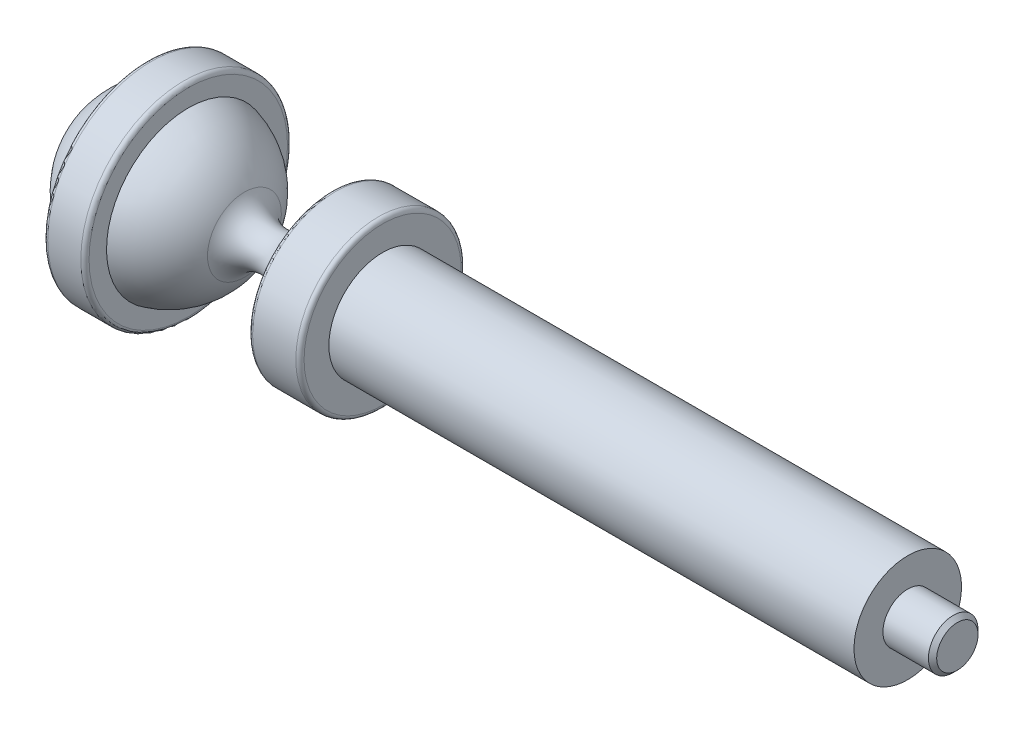
ISO-10303-21;
HEADER;
FILE_DESCRIPTION(('STEP AP214'),'2;1');
FILE_NAME('part.step','',(''),(''),'','','');
FILE_SCHEMA(('AUTOMOTIVE_DESIGN { 1 0 10303 214 1 1 1 1 }'));
ENDSEC;
DATA;
#1=APPLICATION_CONTEXT('core data for automotive mechanical design processes');
#2=APPLICATION_PROTOCOL_DEFINITION('international standard','automotive_design',2000,#1);
#3=PRODUCT_CONTEXT('',#1,'mechanical');
#4=PRODUCT('Part','Part','',(#3));
#5=PRODUCT_RELATED_PRODUCT_CATEGORY('part','',(#4));
#6=PRODUCT_DEFINITION_FORMATION('','',#4);
#7=PRODUCT_DEFINITION_CONTEXT('part definition',#1,'design');
#8=PRODUCT_DEFINITION('design','',#6,#7);
#9=PRODUCT_DEFINITION_SHAPE('','',#8);
#10=(LENGTH_UNIT() NAMED_UNIT(*) SI_UNIT(.MILLI.,.METRE.));
#11=(NAMED_UNIT(*) PLANE_ANGLE_UNIT() SI_UNIT($,.RADIAN.));
#12=(NAMED_UNIT(*) SI_UNIT($,.STERADIAN.) SOLID_ANGLE_UNIT());
#13=UNCERTAINTY_MEASURE_WITH_UNIT(LENGTH_MEASURE(1.E-05),#10,'distance_accuracy_value','');
#14=(GEOMETRIC_REPRESENTATION_CONTEXT(3) GLOBAL_UNCERTAINTY_ASSIGNED_CONTEXT((#13)) GLOBAL_UNIT_ASSIGNED_CONTEXT((#10,
#11,#12)) REPRESENTATION_CONTEXT('',''));
#15=CARTESIAN_POINT('',(0.,0.,0.));
#16=DIRECTION('',(0.,0.,1.));
#17=DIRECTION('',(1.,0.,0.));
#18=AXIS2_PLACEMENT_3D('',#15,#16,#17);
#19=CARTESIAN_POINT('',(10.16,0.,0.));
#20=DIRECTION('',(-1.,0.,0.));
#21=DIRECTION('',(0.,1.,0.));
#22=AXIS2_PLACEMENT_3D('',#19,#20,#21);
#23=SPHERICAL_SURFACE('',#22,10.16);
#24=CARTESIAN_POINT('',(7.5,0.,0.));
#25=DIRECTION('',(-1.,0.,0.));
#26=DIRECTION('',(0.,0.,1.));
#27=AXIS2_PLACEMENT_3D('',#24,#25,#26);
#28=CIRCLE('',#27,9.80561063881286);
#29=CARTESIAN_POINT('',(7.5,0.,9.80561063881286));
#30=VERTEX_POINT('',#29);
#31=EDGE_CURVE('E91',#30,#30,#28,.T.);
#32=ORIENTED_EDGE('',*,*,#31,.T.);
#33=EDGE_LOOP('',(#32));
#34=FACE_BOUND('',#33,.T.);
#35=ADVANCED_FACE('F35',(#34),#23,.T.);
#36=CARTESIAN_POINT('',(105.5,2.50000000000001,0.));
#37=DIRECTION('',(-1.,0.,0.));
#38=DIRECTION('',(0.,0.,1.));
#39=AXIS2_PLACEMENT_3D('',#36,#37,#38);
#40=PLANE('',#39);
#41=CARTESIAN_POINT('',(105.5,0.,0.));
#42=DIRECTION('',(-1.,0.,0.));
#43=DIRECTION('',(0.,0.,1.));
#44=AXIS2_PLACEMENT_3D('',#41,#42,#43);
#45=CIRCLE('',#44,2.50000000000001);
#46=CARTESIAN_POINT('',(105.5,0.,2.50000000000001));
#47=VERTEX_POINT('',#46);
#48=EDGE_CURVE('E67',#47,#47,#45,.T.);
#49=ORIENTED_EDGE('',*,*,#48,.F.);
#50=EDGE_LOOP('',(#49));
#51=FACE_BOUND('',#50,.T.);
#52=ADVANCED_FACE('F112',(#51),#40,.F.);
#53=CARTESIAN_POINT('',(105.5,0.,0.));
#54=DIRECTION('',(-1.,0.,0.));
#55=DIRECTION('',(0.,0.,1.));
#56=AXIS2_PLACEMENT_3D('',#53,#54,#55);
#57=CONICAL_SURFACE('',#56,2.50000000000001,0.785398163397448);
#58=CARTESIAN_POINT('',(105.,0.,0.));
#59=DIRECTION('',(-1.,0.,0.));
#60=DIRECTION('',(0.,0.,1.));
#61=AXIS2_PLACEMENT_3D('',#58,#59,#60);
#62=CIRCLE('',#61,3.00000000000001);
#63=CARTESIAN_POINT('',(105.,0.,3.00000000000001));
#64=VERTEX_POINT('',#63);
#65=EDGE_CURVE('E70',#64,#64,#62,.T.);
#66=ORIENTED_EDGE('',*,*,#65,.F.);
#67=EDGE_LOOP('',(#66));
#68=FACE_BOUND('',#67,.T.);
#69=ORIENTED_EDGE('',*,*,#48,.T.);
#70=EDGE_LOOP('',(#69));
#71=FACE_BOUND('',#70,.T.);
#72=ADVANCED_FACE('F117',(#68,#71),#57,.T.);
#73=CARTESIAN_POINT('',(0.,0.,0.));
#74=DIRECTION('',(-1.,0.,0.));
#75=DIRECTION('',(0.,0.,1.));
#76=AXIS2_PLACEMENT_3D('',#73,#74,#75);
#77=CYLINDRICAL_SURFACE('',#76,3.00000000000001);
#78=CARTESIAN_POINT('',(99.5,0.,0.));
#79=DIRECTION('',(-1.,0.,0.));
#80=DIRECTION('',(0.,0.,1.));
#81=AXIS2_PLACEMENT_3D('',#78,#79,#80);
#82=CIRCLE('',#81,3.00000000000001);
#83=CARTESIAN_POINT('',(99.5,0.,3.00000000000001));
#84=VERTEX_POINT('',#83);
#85=EDGE_CURVE('E73',#84,#84,#82,.T.);
#86=ORIENTED_EDGE('',*,*,#85,.F.);
#87=EDGE_LOOP('',(#86));
#88=FACE_BOUND('',#87,.T.);
#89=ORIENTED_EDGE('',*,*,#65,.T.);
#90=EDGE_LOOP('',(#89));
#91=FACE_BOUND('',#90,.T.);
#92=ADVANCED_FACE('F242',(#88,#91),#77,.T.);
#93=CARTESIAN_POINT('',(99.5,6.5,0.));
#94=DIRECTION('',(-1.,0.,0.));
#95=DIRECTION('',(0.,0.,1.));
#96=AXIS2_PLACEMENT_3D('',#93,#94,#95);
#97=PLANE('',#96);
#98=CARTESIAN_POINT('',(99.5,0.,0.));
#99=DIRECTION('',(-1.,0.,0.));
#100=DIRECTION('',(0.,0.,1.));
#101=AXIS2_PLACEMENT_3D('',#98,#99,#100);
#102=CIRCLE('',#101,6.5);
#103=CARTESIAN_POINT('',(99.5,0.,6.5));
#104=VERTEX_POINT('',#103);
#105=EDGE_CURVE('E76',#104,#104,#102,.T.);
#106=ORIENTED_EDGE('',*,*,#105,.F.);
#107=EDGE_LOOP('',(#106));
#108=FACE_BOUND('',#107,.T.);
#109=ORIENTED_EDGE('',*,*,#85,.T.);
#110=EDGE_LOOP('',(#109));
#111=FACE_BOUND('',#110,.T.);
#112=ADVANCED_FACE('F232',(#108,#111),#97,.F.);
#113=CARTESIAN_POINT('',(0.,0.,0.));
#114=DIRECTION('',(-1.,0.,0.));
#115=DIRECTION('',(0.,0.,1.));
#116=AXIS2_PLACEMENT_3D('',#113,#114,#115);
#117=CYLINDRICAL_SURFACE('',#116,6.5);
#118=CARTESIAN_POINT('',(36.,0.,0.));
#119=DIRECTION('',(-1.,0.,0.));
#120=DIRECTION('',(0.,0.,1.));
#121=AXIS2_PLACEMENT_3D('',#118,#119,#120);
#122=CIRCLE('',#121,6.49999999999999);
#123=CARTESIAN_POINT('',(36.,0.,6.49999999999999));
#124=VERTEX_POINT('',#123);
#125=EDGE_CURVE('E79',#124,#124,#122,.T.);
#126=ORIENTED_EDGE('',*,*,#125,.F.);
#127=EDGE_LOOP('',(#126));
#128=FACE_BOUND('',#127,.T.);
#129=ORIENTED_EDGE('',*,*,#105,.T.);
#130=EDGE_LOOP('',(#129));
#131=FACE_BOUND('',#130,.T.);
#132=ADVANCED_FACE('F208',(#128,#131),#117,.T.);
#133=CARTESIAN_POINT('',(36.,6.49999999999999,0.));
#134=DIRECTION('',(-1.,0.,0.));
#135=DIRECTION('',(0.,0.,1.));
#136=AXIS2_PLACEMENT_3D('',#133,#134,#135);
#137=PLANE('',#136);
#138=CARTESIAN_POINT('',(36.,0.,0.));
#139=DIRECTION('',(-1.,0.,0.));
#140=DIRECTION('',(0.,0.,1.));
#141=AXIS2_PLACEMENT_3D('',#138,#139,#140);
#142=CIRCLE('',#141,9.5);
#143=CARTESIAN_POINT('',(36.,0.,9.5));
#144=VERTEX_POINT('',#143);
#145=EDGE_CURVE('E58',#144,#144,#142,.F.);
#146=ORIENTED_EDGE('',*,*,#145,.T.);
#147=EDGE_LOOP('',(#146));
#148=FACE_BOUND('',#147,.T.);
#149=ORIENTED_EDGE('',*,*,#125,.T.);
#150=EDGE_LOOP('',(#149));
#151=FACE_BOUND('',#150,.T.);
#152=ADVANCED_FACE('F198',(#148,#151),#137,.F.);
#153=CARTESIAN_POINT('',(0.,0.,0.));
#154=DIRECTION('',(-1.,0.,0.));
#155=DIRECTION('',(0.,0.,1.));
#156=AXIS2_PLACEMENT_3D('',#153,#154,#155);
#157=CYLINDRICAL_SURFACE('',#156,10.);
#158=CARTESIAN_POINT('',(35.5,0.,0.));
#159=DIRECTION('',(-1.,0.,0.));
#160=DIRECTION('',(0.,0.,1.));
#161=AXIS2_PLACEMENT_3D('',#158,#159,#160);
#162=CIRCLE('',#161,10.);
#163=CARTESIAN_POINT('',(35.5,0.,10.));
#164=VERTEX_POINT('',#163);
#165=EDGE_CURVE('E61',#164,#164,#162,.T.);
#166=ORIENTED_EDGE('',*,*,#165,.T.);
#167=EDGE_LOOP('',(#166));
#168=FACE_BOUND('',#167,.T.);
#169=CARTESIAN_POINT('',(30.2754821344869,0.,0.));
#170=DIRECTION('',(1.,0.,0.));
#171=DIRECTION('',(0.,0.,-1.));
#172=AXIS2_PLACEMENT_3D('',#169,#170,#171);
#173=CIRCLE('',#172,10.);
#174=CARTESIAN_POINT('',(30.2754821344869,0.,-10.));
#175=VERTEX_POINT('',#174);
#176=EDGE_CURVE('E64',#175,#175,#173,.T.);
#177=ORIENTED_EDGE('',*,*,#176,.T.);
#178=EDGE_LOOP('',(#177));
#179=FACE_BOUND('',#178,.T.);
#180=ADVANCED_FACE('F186',(#168,#179),#157,.T.);
#181=CARTESIAN_POINT('',(30.,0.,0.));
#182=DIRECTION('',(1.,0.,0.));
#183=DIRECTION('',(0.,0.,-1.));
#184=AXIS2_PLACEMENT_3D('',#181,#182,#183);
#185=CONICAL_SURFACE('',#184,10.,1.00716646228517);
#186=CARTESIAN_POINT('',(29.8528214346647,0.,0.));
#187=DIRECTION('',(-1.,0.,0.));
#188=DIRECTION('',(0.,0.,1.));
#189=AXIS2_PLACEMENT_3D('',#186,#187,#188);
#190=CIRCLE('',#189,9.76712905649842);
#191=CARTESIAN_POINT('',(29.8528214346647,0.,9.76712905649842));
#192=VERTEX_POINT('',#191);
#193=EDGE_CURVE('E55',#192,#192,#190,.T.);
#194=ORIENTED_EDGE('',*,*,#193,.T.);
#195=EDGE_LOOP('',(#194));
#196=FACE_BOUND('',#195,.T.);
#197=CARTESIAN_POINT('',(26.2612855985783,0.,0.));
#198=DIRECTION('',(-1.,0.,0.));
#199=DIRECTION('',(0.,0.,1.));
#200=AXIS2_PLACEMENT_3D('',#197,#198,#199);
#201=CIRCLE('',#200,4.08447861848418);
#202=CARTESIAN_POINT('',(26.2612855985783,0.,4.08447861848418));
#203=VERTEX_POINT('',#202);
#204=EDGE_CURVE('E82',#203,#203,#201,.T.);
#205=ORIENTED_EDGE('',*,*,#204,.F.);
#206=EDGE_LOOP('',(#205));
#207=FACE_BOUND('',#206,.T.);
#208=ADVANCED_FACE('F180',(#196,#207),#185,.T.);
#209=CARTESIAN_POINT('',(22.88,0.,0.));
#210=DIRECTION('',(-1.,0.,0.));
#211=DIRECTION('',(0.,0.,1.));
#212=AXIS2_PLACEMENT_3D('',#209,#210,#211);
#213=TOROIDAL_SURFACE('',#212,6.22151107047156,4.);
#214=CARTESIAN_POINT('',(19.2867796610169,0.,0.));
#215=DIRECTION('',(-1.,0.,0.));
#216=DIRECTION('',(0.,0.,1.));
#217=AXIS2_PLACEMENT_3D('',#214,#215,#216);
#218=CIRCLE('',#217,4.46402206751349);
#219=CARTESIAN_POINT('',(19.2867796610169,4.46402206751349,0.));
#220=VERTEX_POINT('',#219);
#221=EDGE_CURVE('E85',#220,#220,#218,.T.);
#222=ORIENTED_EDGE('',*,*,#221,.F.);
#223=EDGE_LOOP('',(#222));
#224=FACE_BOUND('',#223,.T.);
#225=ORIENTED_EDGE('',*,*,#204,.T.);
#226=EDGE_LOOP('',(#225));
#227=FACE_BOUND('',#226,.T.);
#228=ADVANCED_FACE('F185',(#224,#227),#213,.F.);
#229=CARTESIAN_POINT('',(10.16,0.,0.));
#230=DIRECTION('',(-1.,0.,0.));
#231=DIRECTION('',(0.,1.,0.));
#232=AXIS2_PLACEMENT_3D('',#229,#230,#231);
#233=SPHERICAL_SURFACE('',#232,10.16);
#234=CARTESIAN_POINT('',(12.5,0.,0.));
#235=DIRECTION('',(-1.,0.,0.));
#236=DIRECTION('',(0.,0.,1.));
#237=AXIS2_PLACEMENT_3D('',#234,#235,#236);
#238=CIRCLE('',#237,9.88685996664259);
#239=CARTESIAN_POINT('',(12.5,9.88685996664259,0.));
#240=VERTEX_POINT('',#239);
#241=EDGE_CURVE('E88',#240,#240,#238,.T.);
#242=CARTESIAN_POINT('',(12.5,9.88685996664259,0.));
#243=CARTESIAN_POINT('',(12.5909896100767,9.86532511131819,0.));
#244=CARTESIAN_POINT('',(12.681681758861,9.84253350962999,0.));
#245=CARTESIAN_POINT('',(12.8624024053367,9.79445568539119,0.));
#246=CARTESIAN_POINT('',(12.952430903028,9.76916946284059,0.));
#247=CARTESIAN_POINT('',(13.1317555188093,9.7161212687422,0.));
#248=CARTESIAN_POINT('',(13.2210516368993,9.6883592971944,0.));
#249=CARTESIAN_POINT('',(13.3988434587466,9.63038087352728,0.));
#250=CARTESIAN_POINT('',(13.4873391625039,9.60016442140795,0.));
#251=CARTESIAN_POINT('',(13.6634626947287,9.53730003936186,0.));
#252=CARTESIAN_POINT('',(13.7510905231961,9.5046521094351,0.));
#253=CARTESIAN_POINT('',(13.9254115151283,9.43694966444158,0.));
#254=CARTESIAN_POINT('',(14.012104678593,9.40189514937483,0.));
#255=CARTESIAN_POINT('',(14.1844902606205,9.32940625131689,0.));
#256=CARTESIAN_POINT('',(14.2701826791833,9.2919718683257,0.));
#257=CARTESIAN_POINT('',(14.4405014549953,9.21475176824604,0.));
#258=CARTESIAN_POINT('',(14.5251278122445,9.17496605115756,0.));
#259=CARTESIAN_POINT('',(14.6932499614046,9.09307360824293,0.));
#260=CARTESIAN_POINT('',(14.7767457533155,9.05096688241677,0.));
#261=CARTESIAN_POINT('',(14.9425431295652,8.96446451669651,0.));
#262=CARTESIAN_POINT('',(15.024844713904,8.9200688768024,0.));
#263=CARTESIAN_POINT('',(15.1881909430123,8.82902252222375,0.));
#264=CARTESIAN_POINT('',(15.2692355877817,8.78237180753922,0.));
#265=CARTESIAN_POINT('',(15.4300061638235,8.68685086153612,0.));
#266=CARTESIAN_POINT('',(15.5097320950957,8.63798063021755,0.));
#267=CARTESIAN_POINT('',(15.6678044753652,8.53805790086127,0.));
#268=CARTESIAN_POINT('',(15.7461509243624,8.48700540282357,0.));
#269=CARTESIAN_POINT('',(15.9014046227747,8.3827570533144,0.));
#270=CARTESIAN_POINT('',(15.9783118721898,8.32956120184292,0.));
#271=CARTESIAN_POINT('',(16.1306285511186,8.22106669246026,0.));
#272=CARTESIAN_POINT('',(16.2060379806323,8.16576803454907,0.));
#273=CARTESIAN_POINT('',(16.3553015411091,8.05311006208429,0.));
#274=CARTESIAN_POINT('',(16.4291556720721,7.9957507475307,0.));
#275=CARTESIAN_POINT('',(16.5752523422793,7.87901518225413,0.));
#276=CARTESIAN_POINT('',(16.6474948815235,7.81963893153116,0.));
#277=CARTESIAN_POINT('',(16.7903133035139,7.69891475173992,0.));
#278=CARTESIAN_POINT('',(16.86088918626,7.63756682267167,0.));
#279=CARTESIAN_POINT('',(17.0003205008357,7.51294604686855,0.));
#280=CARTESIAN_POINT('',(17.0691759326653,7.4496732001337,0.));
#281=CARTESIAN_POINT('',(17.2051138623529,7.32125081688875,0.));
#282=CARTESIAN_POINT('',(17.2721963602111,7.25610128037866,0.));
#283=CARTESIAN_POINT('',(17.4045372902684,7.12397517592679,0.));
#284=CARTESIAN_POINT('',(17.4697957224676,7.05699860798501,0.));
#285=CARTESIAN_POINT('',(17.5984387798615,6.92126949161547,0.));
#286=CARTESIAN_POINT('',(17.6618234050563,6.85251694318771,0.));
#287=CARTESIAN_POINT('',(17.7866705353475,6.71328827047977,0.));
#288=CARTESIAN_POINT('',(17.8481330404439,6.64281214619959,0.));
#289=CARTESIAN_POINT('',(17.9690890825373,6.50019004017255,0.));
#290=CARTESIAN_POINT('',(18.0285826195343,6.42804405842568,0.));
#291=CARTESIAN_POINT('',(18.1455553781701,6.28213722862714,0.));
#292=CARTESIAN_POINT('',(18.2030345998089,6.20837638057546,0.));
#293=CARTESIAN_POINT('',(18.315934915996,6.05929604030469,0.));
#294=CARTESIAN_POINT('',(18.3713560105443,5.98397654808558,0.));
#295=CARTESIAN_POINT('',(18.4800978289205,5.83183632931075,0.));
#296=CARTESIAN_POINT('',(18.5334185527484,5.75501560275501,0.));
#297=CARTESIAN_POINT('',(18.6379189894081,5.59993147067101,0.));
#298=CARTESIAN_POINT('',(18.6890987022399,5.52166806514275,0.));
#299=CARTESIAN_POINT('',(18.7892780995705,5.36375822541184,0.));
#300=CARTESIAN_POINT('',(18.8382777840693,5.28411179120919,0.));
#301=CARTESIAN_POINT('',(18.9340598025912,5.12349661616469,0.));
#302=CARTESIAN_POINT('',(18.9808421366143,5.04252787532284,0.));
#303=CARTESIAN_POINT('',(19.0721536970146,4.87932975137689,0.));
#304=CARTESIAN_POINT('',(19.1166829233918,4.79710036827278,0.));
#305=CARTESIAN_POINT('',(19.2034546957196,4.63144382969606,0.));
#306=CARTESIAN_POINT('',(19.2456972416701,4.54801667422346,0.));
#307=CARTESIAN_POINT('',(19.2867796610169,4.46402206751349,0.));
#308=B_SPLINE_CURVE_WITH_KNOTS('',3,(#242,#243,#244,#245,#246,#247,#248,#249,#250,#251,#252,
#253,#254,#255,#256,#257,#258,#259,#260,#261,#262,#263,#264,#265,#266,#267,#268,#269,#270,#271,
#272,#273,#274,#275,#276,#277,#278,#279,#280,#281,#282,#283,#284,#285,#286,#287,#288,#289,#290,
#291,#292,#293,#294,#295,#296,#297,#298,#299,#300,#301,#302,#303,#304,#305,#306,#307),
.UNSPECIFIED.,.F.,.F.,(4,2,2,2,2,2,2,2,2,2,2,2,2,2,2,2,2,2,2,2,2,2,2,2,2,2,2,2,2,2,2,2,4),(0.,
0.280500834453738,0.561001668907475,0.841502503361214,1.12200333781495,1.40250417226869,
1.68300500672243,1.96350584117616,2.2440066756299,2.52450751008364,2.80500834453738,
3.08550917899111,3.36601001344485,3.64651084789859,3.92701168235233,4.20751251680606,
4.4880133512598,4.76851418571353,5.04901502016727,5.32951585462101,5.61001668907475,
5.89051752352849,6.17101835798222,6.45151919243596,6.7320200268897,7.01252086134344,
7.29302169579717,7.57352253025091,7.85402336470465,8.13452419915838,8.41502503361212,
8.69552586806586,8.9760267025196),.UNSPECIFIED.);
#309=EDGE_CURVE('BSEAM173',#240,#220,#308,.T.);
#310=ORIENTED_EDGE('',*,*,#241,.F.);
#311=ORIENTED_EDGE('',*,*,#221,.T.);
#312=ORIENTED_EDGE('',*,*,#309,.T.);
#313=ORIENTED_EDGE('',*,*,#309,.F.);
#314=EDGE_LOOP('',(#310,#312,#311,#313));
#315=FACE_BOUND('',#314,.T.);
#316=ADVANCED_FACE('F173',(#315),#233,.T.);
#317=CARTESIAN_POINT('',(12.5,12.5,0.));
#318=DIRECTION('',(-1.,0.,0.));
#319=DIRECTION('',(0.,0.,1.));
#320=AXIS2_PLACEMENT_3D('',#317,#318,#319);
#321=PLANE('',#320);
#322=CARTESIAN_POINT('',(12.5,0.,0.));
#323=DIRECTION('',(-1.,0.,0.));
#324=DIRECTION('',(0.,0.,1.));
#325=AXIS2_PLACEMENT_3D('',#322,#323,#324);
#326=CIRCLE('',#325,12.);
#327=CARTESIAN_POINT('',(12.5,0.,12.));
#328=VERTEX_POINT('',#327);
#329=EDGE_CURVE('E42',#328,#328,#326,.F.);
#330=ORIENTED_EDGE('',*,*,#329,.T.);
#331=EDGE_LOOP('',(#330));
#332=FACE_BOUND('',#331,.T.);
#333=ORIENTED_EDGE('',*,*,#241,.T.);
#334=EDGE_LOOP('',(#333));
#335=FACE_BOUND('',#334,.T.);
#336=ADVANCED_FACE('F108',(#332,#335),#321,.F.);
#337=CARTESIAN_POINT('',(0.,0.,0.));
#338=DIRECTION('',(-1.,0.,0.));
#339=DIRECTION('',(0.,0.,1.));
#340=AXIS2_PLACEMENT_3D('',#337,#338,#339);
#341=CYLINDRICAL_SURFACE('',#340,12.5);
#342=CARTESIAN_POINT('',(12.,0.,0.));
#343=DIRECTION('',(-1.,0.,0.));
#344=DIRECTION('',(0.,0.,1.));
#345=AXIS2_PLACEMENT_3D('',#342,#343,#344);
#346=CIRCLE('',#345,12.5);
#347=CARTESIAN_POINT('',(12.,0.,12.5));
#348=VERTEX_POINT('',#347);
#349=EDGE_CURVE('E46',#348,#348,#346,.T.);
#350=ORIENTED_EDGE('',*,*,#349,.T.);
#351=EDGE_LOOP('',(#350));
#352=FACE_BOUND('',#351,.T.);
#353=CARTESIAN_POINT('',(8.,0.,0.));
#354=DIRECTION('',(1.,0.,0.));
#355=DIRECTION('',(0.,0.,-1.));
#356=AXIS2_PLACEMENT_3D('',#353,#354,#355);
#357=CIRCLE('',#356,12.5);
#358=CARTESIAN_POINT('',(8.,0.,-12.5));
#359=VERTEX_POINT('',#358);
#360=EDGE_CURVE('E50',#359,#359,#357,.T.);
#361=ORIENTED_EDGE('',*,*,#360,.T.);
#362=EDGE_LOOP('',(#361));
#363=FACE_BOUND('',#362,.T.);
#364=ADVANCED_FACE('F99',(#352,#363),#341,.T.);
#365=CARTESIAN_POINT('',(7.5,9.80561063881286,0.));
#366=DIRECTION('',(1.,0.,0.));
#367=DIRECTION('',(0.,0.,-1.));
#368=AXIS2_PLACEMENT_3D('',#365,#366,#367);
#369=PLANE('',#368);
#370=CARTESIAN_POINT('',(7.5,0.,0.));
#371=DIRECTION('',(1.,0.,0.));
#372=DIRECTION('',(0.,0.,-1.));
#373=AXIS2_PLACEMENT_3D('',#370,#371,#372);
#374=CIRCLE('',#373,12.);
#375=CARTESIAN_POINT('',(7.5,0.,-12.));
#376=VERTEX_POINT('',#375);
#377=EDGE_CURVE('E10',#376,#376,#374,.F.);
#378=ORIENTED_EDGE('',*,*,#377,.T.);
#379=EDGE_LOOP('',(#378));
#380=FACE_BOUND('',#379,.T.);
#381=ORIENTED_EDGE('',*,*,#31,.F.);
#382=EDGE_LOOP('',(#381));
#383=FACE_BOUND('',#382,.T.);
#384=ADVANCED_FACE('F96',(#380,#383),#369,.F.);
#385=CARTESIAN_POINT('',(35.5,0.,0.));
#386=DIRECTION('',(-1.,0.,0.));
#387=DIRECTION('',(0.,0.,1.));
#388=AXIS2_PLACEMENT_3D('',#385,#386,#387);
#389=TOROIDAL_SURFACE('',#388,9.5,0.5);
#390=ORIENTED_EDGE('',*,*,#145,.F.);
#391=EDGE_LOOP('',(#390));
#392=FACE_BOUND('',#391,.T.);
#393=ORIENTED_EDGE('',*,*,#165,.F.);
#394=EDGE_LOOP('',(#393));
#395=FACE_BOUND('',#394,.T.);
#396=ADVANCED_FACE('F98',(#392,#395),#389,.T.);
#397=CARTESIAN_POINT('',(30.2754821344869,0.,0.));
#398=DIRECTION('',(1.,0.,0.));
#399=DIRECTION('',(0.,0.,-1.));
#400=AXIS2_PLACEMENT_3D('',#397,#398,#399);
#401=TOROIDAL_SURFACE('',#400,9.5,0.5);
#402=ORIENTED_EDGE('',*,*,#176,.F.);
#403=EDGE_LOOP('',(#402));
#404=FACE_BOUND('',#403,.T.);
#405=ORIENTED_EDGE('',*,*,#193,.F.);
#406=EDGE_LOOP('',(#405));
#407=FACE_BOUND('',#406,.T.);
#408=ADVANCED_FACE('F105',(#404,#407),#401,.T.);
#409=CARTESIAN_POINT('',(12.,0.,0.));
#410=DIRECTION('',(-1.,0.,0.));
#411=DIRECTION('',(0.,0.,1.));
#412=AXIS2_PLACEMENT_3D('',#409,#410,#411);
#413=TOROIDAL_SURFACE('',#412,12.,0.5);
#414=ORIENTED_EDGE('',*,*,#329,.F.);
#415=EDGE_LOOP('',(#414));
#416=FACE_BOUND('',#415,.T.);
#417=ORIENTED_EDGE('',*,*,#349,.F.);
#418=EDGE_LOOP('',(#417));
#419=FACE_BOUND('',#418,.T.);
#420=ADVANCED_FACE('F123',(#416,#419),#413,.T.);
#421=CARTESIAN_POINT('',(8.,0.,0.));
#422=DIRECTION('',(1.,0.,0.));
#423=DIRECTION('',(0.,0.,-1.));
#424=AXIS2_PLACEMENT_3D('',#421,#422,#423);
#425=TOROIDAL_SURFACE('',#424,12.,0.5);
#426=ORIENTED_EDGE('',*,*,#360,.F.);
#427=EDGE_LOOP('',(#426));
#428=FACE_BOUND('',#427,.T.);
#429=ORIENTED_EDGE('',*,*,#377,.F.);
#430=EDGE_LOOP('',(#429));
#431=FACE_BOUND('',#430,.T.);
#432=ADVANCED_FACE('F37',(#428,#431),#425,.T.);
#433=CLOSED_SHELL('',(#35,#52,#72,#92,#112,#132,#152,#180,#208,#228,#316,#336,#364,#384,#396,
#408,#420,#432));
#434=MANIFOLD_SOLID_BREP('B2',#433);
#435=ADVANCED_BREP_SHAPE_REPRESENTATION('',(#18,#434),#14);
#436=SHAPE_DEFINITION_REPRESENTATION(#9,#435);
ENDSEC;
END-ISO-10303-21;
